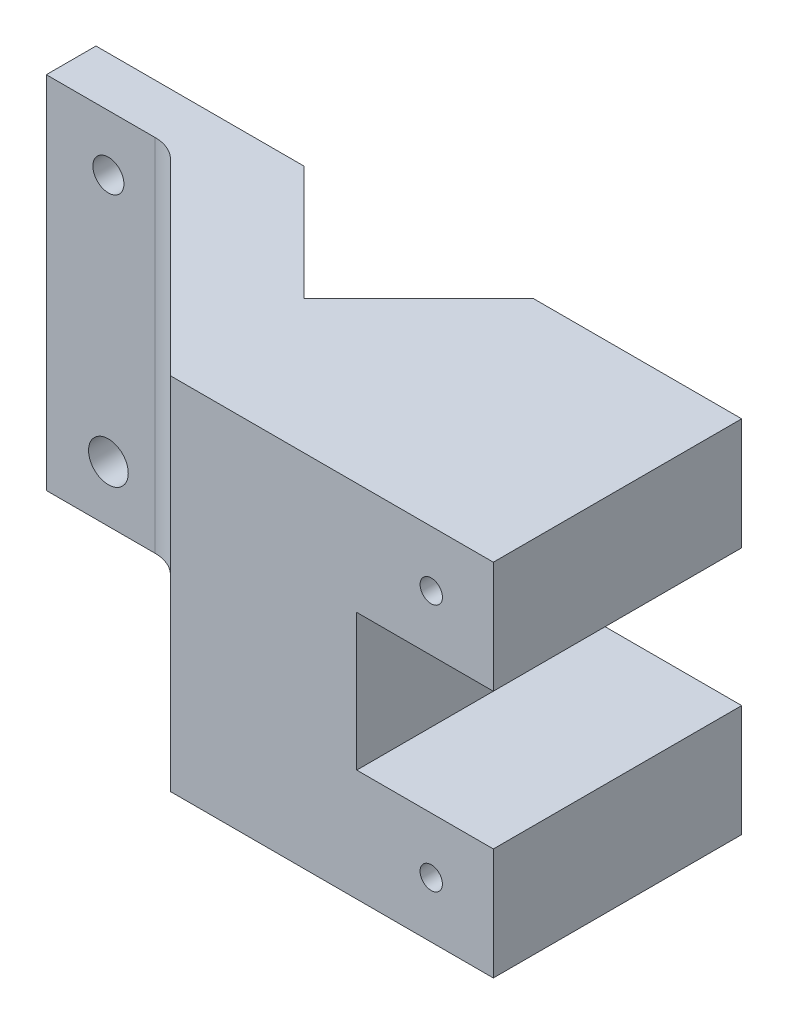
ISO-10303-21;
HEADER;
FILE_DESCRIPTION(('STEP AP214'),'2;1');
FILE_NAME('part.step','',(''),(''),'','','');
FILE_SCHEMA(('AUTOMOTIVE_DESIGN { 1 0 10303 214 1 1 1 1 }'));
ENDSEC;
DATA;
#1=APPLICATION_CONTEXT('core data for automotive mechanical design processes');
#2=APPLICATION_PROTOCOL_DEFINITION('international standard','automotive_design',2000,#1);
#3=PRODUCT_CONTEXT('',#1,'mechanical');
#4=PRODUCT('Part','Part','',(#3));
#5=PRODUCT_RELATED_PRODUCT_CATEGORY('part','',(#4));
#6=PRODUCT_DEFINITION_FORMATION('','',#4);
#7=PRODUCT_DEFINITION_CONTEXT('part definition',#1,'design');
#8=PRODUCT_DEFINITION('design','',#6,#7);
#9=PRODUCT_DEFINITION_SHAPE('','',#8);
#10=(LENGTH_UNIT() NAMED_UNIT(*) SI_UNIT(.MILLI.,.METRE.));
#11=(NAMED_UNIT(*) PLANE_ANGLE_UNIT() SI_UNIT($,.RADIAN.));
#12=(NAMED_UNIT(*) SI_UNIT($,.STERADIAN.) SOLID_ANGLE_UNIT());
#13=UNCERTAINTY_MEASURE_WITH_UNIT(LENGTH_MEASURE(1.E-05),#10,'distance_accuracy_value','');
#14=(GEOMETRIC_REPRESENTATION_CONTEXT(3) GLOBAL_UNCERTAINTY_ASSIGNED_CONTEXT((#13)) GLOBAL_UNIT_ASSIGNED_CONTEXT((#10,
#11,#12)) REPRESENTATION_CONTEXT('',''));
#15=CARTESIAN_POINT('',(0.,0.,0.));
#16=DIRECTION('',(0.,0.,1.));
#17=DIRECTION('',(1.,0.,0.));
#18=AXIS2_PLACEMENT_3D('',#15,#16,#17);
#19=CARTESIAN_POINT('',(26.,14.5,0.));
#20=DIRECTION('',(-1.,0.,0.));
#21=DIRECTION('',(0.,0.,1.));
#22=AXIS2_PLACEMENT_3D('',#19,#20,#21);
#23=PLANE('',#22);
#24=DIRECTION('',(0.,-1.,0.));
#25=VECTOR('',#24,1.);
#26=CARTESIAN_POINT('',(26.,14.5,0.));
#27=LINE('',#26,#25);
#28=CARTESIAN_POINT('',(26.,-5.5,0.));
#29=VERTEX_POINT('',#28);
#30=CARTESIAN_POINT('',(26.,-14.5,0.));
#31=VERTEX_POINT('',#30);
#32=EDGE_CURVE('E229',#29,#31,#27,.T.);
#33=ORIENTED_EDGE('',*,*,#32,.F.);
#34=DIRECTION('',(0.,0.,1.));
#35=VECTOR('',#34,1.);
#36=CARTESIAN_POINT('',(26.,-5.5,0.));
#37=LINE('',#36,#35);
#38=CARTESIAN_POINT('',(26.,-5.5,20.));
#39=VERTEX_POINT('',#38);
#40=EDGE_CURVE('E189',#29,#39,#37,.T.);
#41=ORIENTED_EDGE('',*,*,#40,.T.);
#42=DIRECTION('',(0.,-1.,0.));
#43=VECTOR('',#42,1.);
#44=CARTESIAN_POINT('',(26.,14.5,20.));
#45=LINE('',#44,#43);
#46=CARTESIAN_POINT('',(26.,-14.5,20.));
#47=VERTEX_POINT('',#46);
#48=EDGE_CURVE('E248',#39,#47,#45,.T.);
#49=ORIENTED_EDGE('',*,*,#48,.T.);
#50=DIRECTION('',(0.,0.,-1.));
#51=VECTOR('',#50,1.);
#52=CARTESIAN_POINT('',(26.,-14.5,0.));
#53=LINE('',#52,#51);
#54=EDGE_CURVE('E240',#47,#31,#53,.T.);
#55=ORIENTED_EDGE('',*,*,#54,.T.);
#56=EDGE_LOOP('',(#33,#41,#49,#55));
#57=FACE_BOUND('',#56,.T.);
#58=ADVANCED_FACE('F33',(#57),#23,.F.);
#59=CARTESIAN_POINT('',(-7.1317279836453,14.5,0.));
#60=DIRECTION('',(0.,0.,1.));
#61=DIRECTION('',(1.,0.,0.));
#62=AXIS2_PLACEMENT_3D('',#59,#60,#61);
#63=PLANE('',#62);
#64=CARTESIAN_POINT('',(-21.,10.,0.));
#65=DIRECTION('',(0.,0.,1.));
#66=DIRECTION('',(1.,0.,0.));
#67=AXIS2_PLACEMENT_3D('',#64,#65,#66);
#68=CIRCLE('',#67,1.25);
#69=CARTESIAN_POINT('',(-19.75,10.,0.));
#70=VERTEX_POINT('',#69);
#71=EDGE_CURVE('E162',#70,#70,#68,.T.);
#72=ORIENTED_EDGE('',*,*,#71,.T.);
#73=EDGE_LOOP('',(#72));
#74=FACE_BOUND('',#73,.T.);
#75=CARTESIAN_POINT('',(-21.,-10.,0.));
#76=DIRECTION('',(0.,0.,1.));
#77=DIRECTION('',(1.,0.,0.));
#78=AXIS2_PLACEMENT_3D('',#75,#76,#77);
#79=CIRCLE('',#78,1.6);
#80=CARTESIAN_POINT('',(-19.4,-10.,0.));
#81=VERTEX_POINT('',#80);
#82=EDGE_CURVE('E169',#81,#81,#79,.T.);
#83=ORIENTED_EDGE('',*,*,#82,.T.);
#84=EDGE_LOOP('',(#83));
#85=FACE_BOUND('',#84,.T.);
#86=DIRECTION('',(-1.,0.,0.));
#87=VECTOR('',#86,1.);
#88=CARTESIAN_POINT('',(-7.1317279836453,14.5,0.));
#89=LINE('',#88,#87);
#90=CARTESIAN_POINT('',(-9.25304832720494,14.5,0.));
#91=VERTEX_POINT('',#90);
#92=CARTESIAN_POINT('',(-26.,14.5,0.));
#93=VERTEX_POINT('',#92);
#94=EDGE_CURVE('E215',#91,#93,#89,.T.);
#95=ORIENTED_EDGE('',*,*,#94,.F.);
#96=DIRECTION('',(0.,1.,0.));
#97=VECTOR('',#96,1.);
#98=CARTESIAN_POINT('',(-9.25304832720494,-14.5,0.));
#99=LINE('',#98,#97);
#100=CARTESIAN_POINT('',(-9.25304832720494,-14.5,0.));
#101=VERTEX_POINT('',#100);
#102=EDGE_CURVE('E146',#101,#91,#99,.T.);
#103=ORIENTED_EDGE('',*,*,#102,.F.);
#104=DIRECTION('',(-1.,0.,0.));
#105=VECTOR('',#104,1.);
#106=CARTESIAN_POINT('',(-7.1317279836453,-14.5,0.));
#107=LINE('',#106,#105);
#108=CARTESIAN_POINT('',(-26.,-14.5,0.));
#109=VERTEX_POINT('',#108);
#110=EDGE_CURVE('E214',#101,#109,#107,.T.);
#111=ORIENTED_EDGE('',*,*,#110,.T.);
#112=DIRECTION('',(0.,-1.,0.));
#113=VECTOR('',#112,1.);
#114=CARTESIAN_POINT('',(-26.,14.5,0.));
#115=LINE('',#114,#113);
#116=EDGE_CURVE('E258',#93,#109,#115,.T.);
#117=ORIENTED_EDGE('',*,*,#116,.F.);
#118=EDGE_LOOP('',(#95,#103,#111,#117));
#119=FACE_BOUND('',#118,.T.);
#120=ADVANCED_FACE('F296',(#74,#85,#119),#63,.F.);
#121=CARTESIAN_POINT('',(-26.,14.5,0.));
#122=DIRECTION('',(1.,0.,0.));
#123=DIRECTION('',(0.,0.,-1.));
#124=AXIS2_PLACEMENT_3D('',#121,#122,#123);
#125=PLANE('',#124);
#126=DIRECTION('',(0.,0.,1.));
#127=VECTOR('',#126,1.);
#128=CARTESIAN_POINT('',(-26.,-14.5,0.));
#129=LINE('',#128,#127);
#130=CARTESIAN_POINT('',(-26.,-14.5,4.));
#131=VERTEX_POINT('',#130);
#132=EDGE_CURVE('E231',#109,#131,#129,.T.);
#133=ORIENTED_EDGE('',*,*,#132,.T.);
#134=DIRECTION('',(0.,-1.,0.));
#135=VECTOR('',#134,1.);
#136=CARTESIAN_POINT('',(-26.,14.5,4.));
#137=LINE('',#136,#135);
#138=CARTESIAN_POINT('',(-26.,14.5,4.));
#139=VERTEX_POINT('',#138);
#140=EDGE_CURVE('E255',#139,#131,#137,.T.);
#141=ORIENTED_EDGE('',*,*,#140,.F.);
#142=DIRECTION('',(0.,0.,1.));
#143=VECTOR('',#142,1.);
#144=CARTESIAN_POINT('',(-26.,14.5,0.));
#145=LINE('',#144,#143);
#146=EDGE_CURVE('E217',#93,#139,#145,.T.);
#147=ORIENTED_EDGE('',*,*,#146,.F.);
#148=ORIENTED_EDGE('',*,*,#116,.T.);
#149=EDGE_LOOP('',(#133,#141,#147,#148));
#150=FACE_BOUND('',#149,.T.);
#151=ADVANCED_FACE('F300',(#150),#125,.F.);
#152=CARTESIAN_POINT('',(-26.,14.5,4.));
#153=DIRECTION('',(0.,0.,-1.));
#154=DIRECTION('',(-1.,0.,0.));
#155=AXIS2_PLACEMENT_3D('',#152,#153,#154);
#156=PLANE('',#155);
#157=CARTESIAN_POINT('',(-21.,10.,4.00000000000001));
#158=DIRECTION('',(0.,0.,1.));
#159=DIRECTION('',(1.,0.,0.));
#160=AXIS2_PLACEMENT_3D('',#157,#158,#159);
#161=CIRCLE('',#160,1.25);
#162=CARTESIAN_POINT('',(-19.75,10.,4.00000000000001));
#163=VERTEX_POINT('',#162);
#164=EDGE_CURVE('E166',#163,#163,#161,.T.);
#165=ORIENTED_EDGE('',*,*,#164,.F.);
#166=EDGE_LOOP('',(#165));
#167=FACE_BOUND('',#166,.T.);
#168=CARTESIAN_POINT('',(-21.,-10.,4.00000000000001));
#169=DIRECTION('',(0.,0.,1.));
#170=DIRECTION('',(1.,0.,0.));
#171=AXIS2_PLACEMENT_3D('',#168,#169,#170);
#172=CIRCLE('',#171,1.6);
#173=CARTESIAN_POINT('',(-19.4,-10.,4.00000000000001));
#174=VERTEX_POINT('',#173);
#175=EDGE_CURVE('E160',#174,#174,#172,.T.);
#176=ORIENTED_EDGE('',*,*,#175,.F.);
#177=EDGE_LOOP('',(#176));
#178=FACE_BOUND('',#177,.T.);
#179=DIRECTION('',(1.,0.,0.));
#180=VECTOR('',#179,1.);
#181=CARTESIAN_POINT('',(-26.,-14.5,4.));
#182=LINE('',#181,#180);
#183=CARTESIAN_POINT('',(-17.2426406871193,-14.5,4.));
#184=VERTEX_POINT('',#183);
#185=EDGE_CURVE('E233',#131,#184,#182,.T.);
#186=ORIENTED_EDGE('',*,*,#185,.T.);
#187=DIRECTION('',(0.,-1.,0.));
#188=VECTOR('',#187,1.);
#189=CARTESIAN_POINT('',(-17.2426406871193,14.5,4.));
#190=LINE('',#189,#188);
#191=CARTESIAN_POINT('',(-17.2426406871193,14.5,4.));
#192=VERTEX_POINT('',#191);
#193=EDGE_CURVE('E56',#184,#192,#190,.F.);
#194=ORIENTED_EDGE('',*,*,#193,.T.);
#195=DIRECTION('',(1.,0.,0.));
#196=VECTOR('',#195,1.);
#197=CARTESIAN_POINT('',(-26.,14.5,4.));
#198=LINE('',#197,#196);
#199=EDGE_CURVE('E220',#139,#192,#198,.T.);
#200=ORIENTED_EDGE('',*,*,#199,.F.);
#201=ORIENTED_EDGE('',*,*,#140,.T.);
#202=EDGE_LOOP('',(#186,#194,#200,#201));
#203=FACE_BOUND('',#202,.T.);
#204=ADVANCED_FACE('F273',(#167,#178,#203),#156,.F.);
#205=CARTESIAN_POINT('',(-16.,14.5,4.));
#206=DIRECTION('',(0.707106781186548,0.,-0.707106781186548));
#207=DIRECTION('',(-0.707106781186548,0.,-0.707106781186548));
#208=AXIS2_PLACEMENT_3D('',#205,#206,#207);
#209=PLANE('',#208);
#210=DIRECTION('',(0.707106781186548,0.,0.707106781186548));
#211=VECTOR('',#210,1.);
#212=CARTESIAN_POINT('',(-16.,14.5,4.));
#213=LINE('',#212,#211);
#214=CARTESIAN_POINT('',(-15.1213203435596,14.5,4.87867965644036));
#215=VERTEX_POINT('',#214);
#216=CARTESIAN_POINT('',(0.,14.5,20.));
#217=VERTEX_POINT('',#216);
#218=EDGE_CURVE('E222',#215,#217,#213,.T.);
#219=ORIENTED_EDGE('',*,*,#218,.F.);
#220=DIRECTION('',(0.,-1.,0.));
#221=VECTOR('',#220,1.);
#222=CARTESIAN_POINT('',(-15.1213203435596,-14.5,4.87867965644036));
#223=LINE('',#222,#221);
#224=CARTESIAN_POINT('',(-15.1213203435596,-14.5,4.87867965644036));
#225=VERTEX_POINT('',#224);
#226=EDGE_CURVE('E261',#215,#225,#223,.T.);
#227=ORIENTED_EDGE('',*,*,#226,.T.);
#228=DIRECTION('',(0.707106781186548,0.,0.707106781186548));
#229=VECTOR('',#228,1.);
#230=CARTESIAN_POINT('',(-16.,-14.5,4.));
#231=LINE('',#230,#229);
#232=CARTESIAN_POINT('',(0.,-14.5,20.));
#233=VERTEX_POINT('',#232);
#234=EDGE_CURVE('E235',#225,#233,#231,.T.);
#235=ORIENTED_EDGE('',*,*,#234,.T.);
#236=DIRECTION('',(0.,-1.,0.));
#237=VECTOR('',#236,1.);
#238=CARTESIAN_POINT('',(0.,14.5,20.));
#239=LINE('',#238,#237);
#240=EDGE_CURVE('E252',#217,#233,#239,.T.);
#241=ORIENTED_EDGE('',*,*,#240,.F.);
#242=EDGE_LOOP('',(#219,#227,#235,#241));
#243=FACE_BOUND('',#242,.T.);
#244=ADVANCED_FACE('F279',(#243),#209,.F.);
#245=CARTESIAN_POINT('',(26.,14.5,20.));
#246=DIRECTION('',(0.,0.,-1.));
#247=DIRECTION('',(-1.,0.,0.));
#248=AXIS2_PLACEMENT_3D('',#245,#246,#247);
#249=PLANE('',#248);
#250=CARTESIAN_POINT('',(21.,-10.,20.));
#251=DIRECTION('',(0.,0.,-1.));
#252=DIRECTION('',(-1.,0.,0.));
#253=AXIS2_PLACEMENT_3D('',#250,#251,#252);
#254=CIRCLE('',#253,0.9);
#255=CARTESIAN_POINT('',(20.1,-10.,20.));
#256=VERTEX_POINT('',#255);
#257=EDGE_CURVE('E211',#256,#256,#254,.T.);
#258=ORIENTED_EDGE('',*,*,#257,.T.);
#259=EDGE_LOOP('',(#258));
#260=FACE_BOUND('',#259,.T.);
#261=CARTESIAN_POINT('',(21.,10.,20.));
#262=DIRECTION('',(0.,0.,-1.));
#263=DIRECTION('',(-1.,0.,0.));
#264=AXIS2_PLACEMENT_3D('',#261,#262,#263);
#265=CIRCLE('',#264,0.9);
#266=CARTESIAN_POINT('',(20.1,10.,20.));
#267=VERTEX_POINT('',#266);
#268=EDGE_CURVE('E208',#267,#267,#265,.T.);
#269=ORIENTED_EDGE('',*,*,#268,.T.);
#270=EDGE_LOOP('',(#269));
#271=FACE_BOUND('',#270,.T.);
#272=ORIENTED_EDGE('',*,*,#48,.F.);
#273=DIRECTION('',(-1.,0.,0.));
#274=VECTOR('',#273,1.);
#275=CARTESIAN_POINT('',(26.,-5.5,20.));
#276=LINE('',#275,#274);
#277=CARTESIAN_POINT('',(15.,-5.5,20.));
#278=VERTEX_POINT('',#277);
#279=EDGE_CURVE('E205',#39,#278,#276,.T.);
#280=ORIENTED_EDGE('',*,*,#279,.T.);
#281=DIRECTION('',(0.,1.,0.));
#282=VECTOR('',#281,1.);
#283=CARTESIAN_POINT('',(15.,14.5,20.));
#284=LINE('',#283,#282);
#285=CARTESIAN_POINT('',(15.,5.5,20.));
#286=VERTEX_POINT('',#285);
#287=EDGE_CURVE('E202',#278,#286,#284,.T.);
#288=ORIENTED_EDGE('',*,*,#287,.T.);
#289=DIRECTION('',(1.,0.,0.));
#290=VECTOR('',#289,1.);
#291=CARTESIAN_POINT('',(26.,5.5,20.));
#292=LINE('',#291,#290);
#293=CARTESIAN_POINT('',(26.,5.5,20.));
#294=VERTEX_POINT('',#293);
#295=EDGE_CURVE('E192',#286,#294,#292,.T.);
#296=ORIENTED_EDGE('',*,*,#295,.T.);
#297=CARTESIAN_POINT('',(26.,14.5,20.));
#298=VERTEX_POINT('',#297);
#299=EDGE_CURVE('E249',#298,#294,#45,.T.);
#300=ORIENTED_EDGE('',*,*,#299,.F.);
#301=DIRECTION('',(1.,0.,0.));
#302=VECTOR('',#301,1.);
#303=CARTESIAN_POINT('',(26.,14.5,20.));
#304=LINE('',#303,#302);
#305=EDGE_CURVE('E224',#217,#298,#304,.T.);
#306=ORIENTED_EDGE('',*,*,#305,.F.);
#307=ORIENTED_EDGE('',*,*,#240,.T.);
#308=DIRECTION('',(1.,0.,0.));
#309=VECTOR('',#308,1.);
#310=CARTESIAN_POINT('',(26.,-14.5,20.));
#311=LINE('',#310,#309);
#312=EDGE_CURVE('E237',#233,#47,#311,.T.);
#313=ORIENTED_EDGE('',*,*,#312,.T.);
#314=EDGE_LOOP('',(#272,#280,#288,#296,#300,#306,#307,#313));
#315=FACE_BOUND('',#314,.T.);
#316=ADVANCED_FACE('F284',(#260,#271,#315),#249,.F.);
#317=ORIENTED_EDGE('',*,*,#299,.T.);
#318=DIRECTION('',(0.,0.,1.));
#319=VECTOR('',#318,1.);
#320=CARTESIAN_POINT('',(26.,5.5,0.));
#321=LINE('',#320,#319);
#322=CARTESIAN_POINT('',(26.,5.5,0.));
#323=VERTEX_POINT('',#322);
#324=EDGE_CURVE('E188',#323,#294,#321,.T.);
#325=ORIENTED_EDGE('',*,*,#324,.F.);
#326=CARTESIAN_POINT('',(26.,14.5,0.));
#327=VERTEX_POINT('',#326);
#328=EDGE_CURVE('E245',#327,#323,#27,.T.);
#329=ORIENTED_EDGE('',*,*,#328,.F.);
#330=DIRECTION('',(0.,0.,-1.));
#331=VECTOR('',#330,1.);
#332=CARTESIAN_POINT('',(26.,14.5,0.));
#333=LINE('',#332,#331);
#334=EDGE_CURVE('E226',#298,#327,#333,.T.);
#335=ORIENTED_EDGE('',*,*,#334,.F.);
#336=EDGE_LOOP('',(#317,#325,#329,#335));
#337=FACE_BOUND('',#336,.T.);
#338=ADVANCED_FACE('F289',(#337),#23,.F.);
#339=CARTESIAN_POINT('',(7.1317279836453,14.5,0.));
#340=DIRECTION('',(0.,0.,1.));
#341=DIRECTION('',(1.,0.,0.));
#342=AXIS2_PLACEMENT_3D('',#339,#340,#341);
#343=PLANE('',#342);
#344=CARTESIAN_POINT('',(21.,-10.,0.));
#345=DIRECTION('',(0.,0.,1.));
#346=DIRECTION('',(1.,0.,0.));
#347=AXIS2_PLACEMENT_3D('',#344,#345,#346);
#348=CIRCLE('',#347,0.9);
#349=CARTESIAN_POINT('',(21.9,-10.,0.));
#350=VERTEX_POINT('',#349);
#351=EDGE_CURVE('E165',#350,#350,#348,.T.);
#352=ORIENTED_EDGE('',*,*,#351,.T.);
#353=EDGE_LOOP('',(#352));
#354=FACE_BOUND('',#353,.T.);
#355=CARTESIAN_POINT('',(21.,10.,0.));
#356=DIRECTION('',(0.,0.,1.));
#357=DIRECTION('',(1.,0.,0.));
#358=AXIS2_PLACEMENT_3D('',#355,#356,#357);
#359=CIRCLE('',#358,0.9);
#360=CARTESIAN_POINT('',(21.9,10.,0.));
#361=VERTEX_POINT('',#360);
#362=EDGE_CURVE('E174',#361,#361,#359,.T.);
#363=ORIENTED_EDGE('',*,*,#362,.T.);
#364=EDGE_LOOP('',(#363));
#365=FACE_BOUND('',#364,.T.);
#366=DIRECTION('',(-1.,0.,0.));
#367=VECTOR('',#366,1.);
#368=CARTESIAN_POINT('',(7.1317279836453,-14.5,0.));
#369=LINE('',#368,#367);
#370=CARTESIAN_POINT('',(9.25304832720494,-14.5,0.));
#371=VERTEX_POINT('',#370);
#372=EDGE_CURVE('E218',#31,#371,#369,.T.);
#373=ORIENTED_EDGE('',*,*,#372,.T.);
#374=DIRECTION('',(0.,1.,0.));
#375=VECTOR('',#374,1.);
#376=CARTESIAN_POINT('',(9.25304832720494,-14.5,0.));
#377=LINE('',#376,#375);
#378=CARTESIAN_POINT('',(9.25304832720494,14.5,0.));
#379=VERTEX_POINT('',#378);
#380=EDGE_CURVE('E48',#371,#379,#377,.T.);
#381=ORIENTED_EDGE('',*,*,#380,.T.);
#382=DIRECTION('',(-1.,0.,0.));
#383=VECTOR('',#382,1.);
#384=CARTESIAN_POINT('',(7.1317279836453,14.5,0.));
#385=LINE('',#384,#383);
#386=EDGE_CURVE('E153',#327,#379,#385,.T.);
#387=ORIENTED_EDGE('',*,*,#386,.F.);
#388=ORIENTED_EDGE('',*,*,#328,.T.);
#389=DIRECTION('',(-1.,0.,0.));
#390=VECTOR('',#389,1.);
#391=CARTESIAN_POINT('',(26.,5.5,0.));
#392=LINE('',#391,#390);
#393=CARTESIAN_POINT('',(15.,5.5,0.));
#394=VERTEX_POINT('',#393);
#395=EDGE_CURVE('E177',#323,#394,#392,.T.);
#396=ORIENTED_EDGE('',*,*,#395,.T.);
#397=DIRECTION('',(0.,-1.,0.));
#398=VECTOR('',#397,1.);
#399=CARTESIAN_POINT('',(15.,5.5,0.));
#400=LINE('',#399,#398);
#401=CARTESIAN_POINT('',(15.,-5.5,0.));
#402=VERTEX_POINT('',#401);
#403=EDGE_CURVE('E182',#394,#402,#400,.T.);
#404=ORIENTED_EDGE('',*,*,#403,.T.);
#405=DIRECTION('',(1.,0.,0.));
#406=VECTOR('',#405,1.);
#407=CARTESIAN_POINT('',(15.,-5.5,0.));
#408=LINE('',#407,#406);
#409=EDGE_CURVE('E185',#402,#29,#408,.T.);
#410=ORIENTED_EDGE('',*,*,#409,.T.);
#411=ORIENTED_EDGE('',*,*,#32,.T.);
#412=EDGE_LOOP('',(#373,#381,#387,#388,#396,#404,#410,#411));
#413=FACE_BOUND('',#412,.T.);
#414=ADVANCED_FACE('F291',(#354,#365,#413),#343,.F.);
#415=CARTESIAN_POINT('',(0.,14.5,0.));
#416=DIRECTION('',(0.,1.,0.));
#417=DIRECTION('',(0.,0.,1.));
#418=AXIS2_PLACEMENT_3D('',#415,#416,#417);
#419=PLANE('',#418);
#420=DIRECTION('',(0.707106781186547,0.,0.707106781186548));
#421=VECTOR('',#420,1.);
#422=CARTESIAN_POINT('',(-9.25304832720494,14.5,0.));
#423=LINE('',#422,#421);
#424=CARTESIAN_POINT('',(0.,14.5,9.25304832720494));
#425=VERTEX_POINT('',#424);
#426=EDGE_CURVE('E143',#91,#425,#423,.T.);
#427=ORIENTED_EDGE('',*,*,#426,.F.);
#428=ORIENTED_EDGE('',*,*,#94,.T.);
#429=ORIENTED_EDGE('',*,*,#146,.T.);
#430=ORIENTED_EDGE('',*,*,#199,.T.);
#431=CARTESIAN_POINT('',(-17.2426406871193,14.5,7.));
#432=DIRECTION('',(0.,1.,0.));
#433=DIRECTION('',(0.,0.,1.));
#434=AXIS2_PLACEMENT_3D('',#431,#432,#433);
#435=CIRCLE('',#434,3.);
#436=EDGE_CURVE('E11',#192,#215,#435,.F.);
#437=ORIENTED_EDGE('',*,*,#436,.T.);
#438=ORIENTED_EDGE('',*,*,#218,.T.);
#439=ORIENTED_EDGE('',*,*,#305,.T.);
#440=ORIENTED_EDGE('',*,*,#334,.T.);
#441=ORIENTED_EDGE('',*,*,#386,.T.);
#442=DIRECTION('',(0.707106781186547,0.,-0.707106781186548));
#443=VECTOR('',#442,1.);
#444=CARTESIAN_POINT('',(0.,14.5,9.25304832720494));
#445=LINE('',#444,#443);
#446=EDGE_CURVE('E137',#425,#379,#445,.T.);
#447=ORIENTED_EDGE('',*,*,#446,.F.);
#448=EDGE_LOOP('',(#427,#428,#429,#430,#437,#438,#439,#440,#441,#447));
#449=FACE_BOUND('',#448,.T.);
#450=ADVANCED_FACE('F151',(#449),#419,.T.);
#451=CARTESIAN_POINT('',(0.,-14.5,0.));
#452=DIRECTION('',(0.,1.,0.));
#453=DIRECTION('',(0.,0.,1.));
#454=AXIS2_PLACEMENT_3D('',#451,#452,#453);
#455=PLANE('',#454);
#456=ORIENTED_EDGE('',*,*,#110,.F.);
#457=DIRECTION('',(0.707106781186547,0.,0.707106781186548));
#458=VECTOR('',#457,1.);
#459=CARTESIAN_POINT('',(-9.25304832720494,-14.5,0.));
#460=LINE('',#459,#458);
#461=CARTESIAN_POINT('',(0.,-14.5,9.25304832720494));
#462=VERTEX_POINT('',#461);
#463=EDGE_CURVE('E154',#101,#462,#460,.T.);
#464=ORIENTED_EDGE('',*,*,#463,.T.);
#465=DIRECTION('',(0.707106781186547,0.,-0.707106781186548));
#466=VECTOR('',#465,1.);
#467=CARTESIAN_POINT('',(0.,-14.5,9.25304832720494));
#468=LINE('',#467,#466);
#469=EDGE_CURVE('E138',#462,#371,#468,.T.);
#470=ORIENTED_EDGE('',*,*,#469,.T.);
#471=ORIENTED_EDGE('',*,*,#372,.F.);
#472=ORIENTED_EDGE('',*,*,#54,.F.);
#473=ORIENTED_EDGE('',*,*,#312,.F.);
#474=ORIENTED_EDGE('',*,*,#234,.F.);
#475=CARTESIAN_POINT('',(-17.2426406871193,-14.5,7.));
#476=DIRECTION('',(0.,1.,0.));
#477=DIRECTION('',(0.,0.,1.));
#478=AXIS2_PLACEMENT_3D('',#475,#476,#477);
#479=CIRCLE('',#478,3.);
#480=EDGE_CURVE('E41',#225,#184,#479,.T.);
#481=ORIENTED_EDGE('',*,*,#480,.T.);
#482=ORIENTED_EDGE('',*,*,#185,.F.);
#483=ORIENTED_EDGE('',*,*,#132,.F.);
#484=EDGE_LOOP('',(#456,#464,#470,#471,#472,#473,#474,#481,#482,#483));
#485=FACE_BOUND('',#484,.T.);
#486=ADVANCED_FACE('F268',(#485),#455,.F.);
#487=CARTESIAN_POINT('',(15.,-5.5,0.));
#488=DIRECTION('',(0.,-1.,0.));
#489=DIRECTION('',(1.,0.,0.));
#490=AXIS2_PLACEMENT_3D('',#487,#488,#489);
#491=PLANE('',#490);
#492=ORIENTED_EDGE('',*,*,#40,.F.);
#493=ORIENTED_EDGE('',*,*,#409,.F.);
#494=DIRECTION('',(0.,0.,1.));
#495=VECTOR('',#494,1.);
#496=CARTESIAN_POINT('',(15.,-5.5,0.));
#497=LINE('',#496,#495);
#498=EDGE_CURVE('E193',#402,#278,#497,.T.);
#499=ORIENTED_EDGE('',*,*,#498,.T.);
#500=ORIENTED_EDGE('',*,*,#279,.F.);
#501=EDGE_LOOP('',(#492,#493,#499,#500));
#502=FACE_BOUND('',#501,.T.);
#503=ADVANCED_FACE('F352',(#502),#491,.F.);
#504=CARTESIAN_POINT('',(15.,5.5,0.));
#505=DIRECTION('',(-1.,0.,0.));
#506=DIRECTION('',(0.,0.,1.));
#507=AXIS2_PLACEMENT_3D('',#504,#505,#506);
#508=PLANE('',#507);
#509=ORIENTED_EDGE('',*,*,#498,.F.);
#510=ORIENTED_EDGE('',*,*,#403,.F.);
#511=DIRECTION('',(0.,0.,1.));
#512=VECTOR('',#511,1.);
#513=CARTESIAN_POINT('',(15.,5.5,0.));
#514=LINE('',#513,#512);
#515=EDGE_CURVE('E196',#394,#286,#514,.T.);
#516=ORIENTED_EDGE('',*,*,#515,.T.);
#517=ORIENTED_EDGE('',*,*,#287,.F.);
#518=EDGE_LOOP('',(#509,#510,#516,#517));
#519=FACE_BOUND('',#518,.T.);
#520=ADVANCED_FACE('F345',(#519),#508,.F.);
#521=CARTESIAN_POINT('',(26.,5.5,0.));
#522=DIRECTION('',(0.,1.,0.));
#523=DIRECTION('',(-1.,0.,0.));
#524=AXIS2_PLACEMENT_3D('',#521,#522,#523);
#525=PLANE('',#524);
#526=ORIENTED_EDGE('',*,*,#515,.F.);
#527=ORIENTED_EDGE('',*,*,#395,.F.);
#528=ORIENTED_EDGE('',*,*,#324,.T.);
#529=ORIENTED_EDGE('',*,*,#295,.F.);
#530=EDGE_LOOP('',(#526,#527,#528,#529));
#531=FACE_BOUND('',#530,.T.);
#532=ADVANCED_FACE('F335',(#531),#525,.F.);
#533=CARTESIAN_POINT('',(21.,10.,0.));
#534=DIRECTION('',(0.,0.,1.));
#535=DIRECTION('',(1.,0.,0.));
#536=AXIS2_PLACEMENT_3D('',#533,#534,#535);
#537=CYLINDRICAL_SURFACE('',#536,0.9);
#538=ORIENTED_EDGE('',*,*,#362,.F.);
#539=EDGE_LOOP('',(#538));
#540=FACE_BOUND('',#539,.T.);
#541=ORIENTED_EDGE('',*,*,#268,.F.);
#542=EDGE_LOOP('',(#541));
#543=FACE_BOUND('',#542,.T.);
#544=ADVANCED_FACE('F332',(#540,#543),#537,.F.);
#545=CARTESIAN_POINT('',(21.,-10.,0.));
#546=DIRECTION('',(0.,0.,1.));
#547=DIRECTION('',(1.,0.,0.));
#548=AXIS2_PLACEMENT_3D('',#545,#546,#547);
#549=CYLINDRICAL_SURFACE('',#548,0.9);
#550=ORIENTED_EDGE('',*,*,#351,.F.);
#551=EDGE_LOOP('',(#550));
#552=FACE_BOUND('',#551,.T.);
#553=ORIENTED_EDGE('',*,*,#257,.F.);
#554=EDGE_LOOP('',(#553));
#555=FACE_BOUND('',#554,.T.);
#556=ADVANCED_FACE('F334',(#552,#555),#549,.F.);
#557=CARTESIAN_POINT('',(-21.,-10.,0.));
#558=DIRECTION('',(0.,0.,1.));
#559=DIRECTION('',(1.,0.,0.));
#560=AXIS2_PLACEMENT_3D('',#557,#558,#559);
#561=CYLINDRICAL_SURFACE('',#560,1.6);
#562=ORIENTED_EDGE('',*,*,#82,.F.);
#563=EDGE_LOOP('',(#562));
#564=FACE_BOUND('',#563,.T.);
#565=ORIENTED_EDGE('',*,*,#175,.T.);
#566=EDGE_LOOP('',(#565));
#567=FACE_BOUND('',#566,.T.);
#568=ADVANCED_FACE('F342',(#564,#567),#561,.F.);
#569=CARTESIAN_POINT('',(-21.,10.,0.));
#570=DIRECTION('',(0.,0.,1.));
#571=DIRECTION('',(1.,0.,0.));
#572=AXIS2_PLACEMENT_3D('',#569,#570,#571);
#573=CYLINDRICAL_SURFACE('',#572,1.25);
#574=ORIENTED_EDGE('',*,*,#71,.F.);
#575=EDGE_LOOP('',(#574));
#576=FACE_BOUND('',#575,.T.);
#577=ORIENTED_EDGE('',*,*,#164,.T.);
#578=EDGE_LOOP('',(#577));
#579=FACE_BOUND('',#578,.T.);
#580=ADVANCED_FACE('F398',(#576,#579),#573,.F.);
#581=CARTESIAN_POINT('',(-17.2426406871193,14.5,7.));
#582=DIRECTION('',(0.,1.,0.));
#583=DIRECTION('',(0.,0.,1.));
#584=AXIS2_PLACEMENT_3D('',#581,#582,#583);
#585=CYLINDRICAL_SURFACE('',#584,3.);
#586=ORIENTED_EDGE('',*,*,#436,.F.);
#587=ORIENTED_EDGE('',*,*,#193,.F.);
#588=ORIENTED_EDGE('',*,*,#480,.F.);
#589=ORIENTED_EDGE('',*,*,#226,.F.);
#590=EDGE_LOOP('',(#586,#587,#588,#589));
#591=FACE_BOUND('',#590,.T.);
#592=ADVANCED_FACE('F35',(#591),#585,.F.);
#593=CARTESIAN_POINT('',(-9.25304832720494,-14.5,0.));
#594=DIRECTION('',(-0.707106781186548,0.,0.707106781186547));
#595=DIRECTION('',(0.707106781186547,0.,0.707106781186548));
#596=AXIS2_PLACEMENT_3D('',#593,#594,#595);
#597=PLANE('',#596);
#598=DIRECTION('',(0.,1.,0.));
#599=VECTOR('',#598,1.);
#600=CARTESIAN_POINT('',(0.,-14.5,9.25304832720494));
#601=LINE('',#600,#599);
#602=EDGE_CURVE('E133',#462,#425,#601,.T.);
#603=ORIENTED_EDGE('',*,*,#602,.F.);
#604=ORIENTED_EDGE('',*,*,#463,.F.);
#605=ORIENTED_EDGE('',*,*,#102,.T.);
#606=ORIENTED_EDGE('',*,*,#426,.T.);
#607=EDGE_LOOP('',(#603,#604,#605,#606));
#608=FACE_BOUND('',#607,.T.);
#609=ADVANCED_FACE('F144',(#608),#597,.F.);
#610=CARTESIAN_POINT('',(0.,-14.5,9.25304832720494));
#611=DIRECTION('',(0.707106781186548,0.,0.707106781186547));
#612=DIRECTION('',(0.707106781186547,0.,-0.707106781186548));
#613=AXIS2_PLACEMENT_3D('',#610,#611,#612);
#614=PLANE('',#613);
#615=ORIENTED_EDGE('',*,*,#380,.F.);
#616=ORIENTED_EDGE('',*,*,#469,.F.);
#617=ORIENTED_EDGE('',*,*,#602,.T.);
#618=ORIENTED_EDGE('',*,*,#446,.T.);
#619=EDGE_LOOP('',(#615,#616,#617,#618));
#620=FACE_BOUND('',#619,.T.);
#621=ADVANCED_FACE('F135',(#620),#614,.F.);
#622=CLOSED_SHELL('',(#58,#120,#151,#204,#244,#316,#338,#414,#450,#486,#503,#520,#532,#544,#556,
#568,#580,#592,#609,#621));
#623=MANIFOLD_SOLID_BREP('B2',#622);
#624=ADVANCED_BREP_SHAPE_REPRESENTATION('',(#18,#623),#14);
#625=SHAPE_DEFINITION_REPRESENTATION(#9,#624);
ENDSEC;
END-ISO-10303-21;
